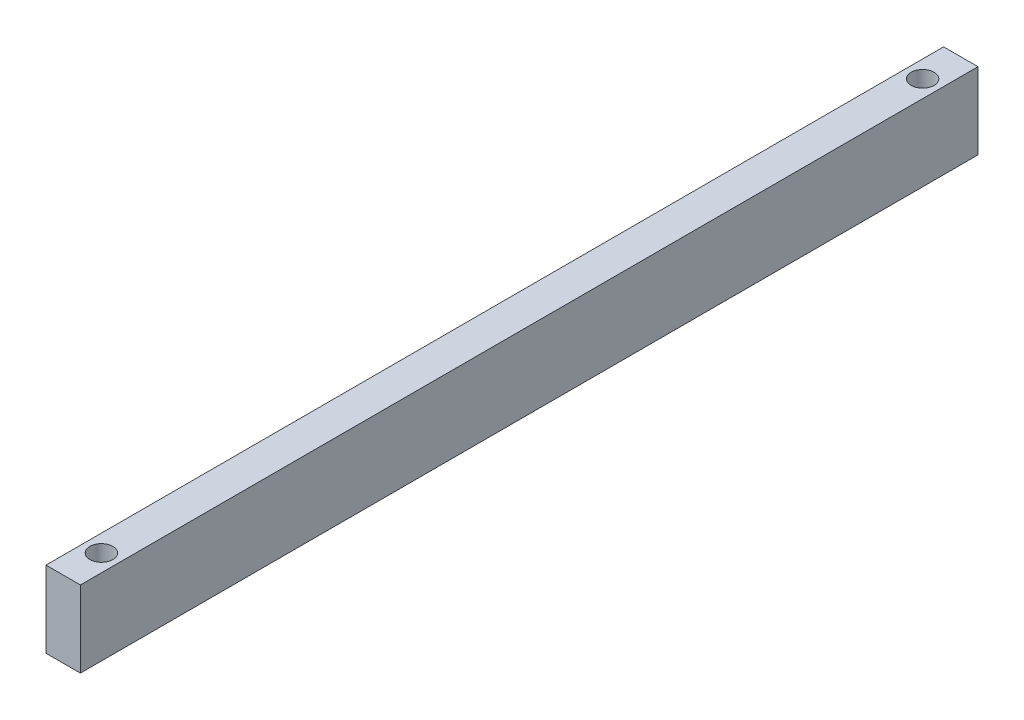
ISO-10303-21;
HEADER;
FILE_DESCRIPTION(('STEP AP214'),'2;1');
FILE_NAME('part.step','',(''),(''),'','','');
FILE_SCHEMA(('AUTOMOTIVE_DESIGN { 1 0 10303 214 1 1 1 1 }'));
ENDSEC;
DATA;
#1=APPLICATION_CONTEXT('core data for automotive mechanical design processes');
#2=APPLICATION_PROTOCOL_DEFINITION('international standard','automotive_design',2000,#1);
#3=PRODUCT_CONTEXT('',#1,'mechanical');
#4=PRODUCT('Part','Part','',(#3));
#5=PRODUCT_RELATED_PRODUCT_CATEGORY('part','',(#4));
#6=PRODUCT_DEFINITION_FORMATION('','',#4);
#7=PRODUCT_DEFINITION_CONTEXT('part definition',#1,'design');
#8=PRODUCT_DEFINITION('design','',#6,#7);
#9=PRODUCT_DEFINITION_SHAPE('','',#8);
#10=(LENGTH_UNIT() NAMED_UNIT(*) SI_UNIT(.MILLI.,.METRE.));
#11=(NAMED_UNIT(*) PLANE_ANGLE_UNIT() SI_UNIT($,.RADIAN.));
#12=(NAMED_UNIT(*) SI_UNIT($,.STERADIAN.) SOLID_ANGLE_UNIT());
#13=UNCERTAINTY_MEASURE_WITH_UNIT(LENGTH_MEASURE(1.E-05),#10,'distance_accuracy_value','');
#14=(GEOMETRIC_REPRESENTATION_CONTEXT(3) GLOBAL_UNCERTAINTY_ASSIGNED_CONTEXT((#13)) GLOBAL_UNIT_ASSIGNED_CONTEXT((#10,
#11,#12)) REPRESENTATION_CONTEXT('',''));
#15=CARTESIAN_POINT('',(0.,0.,0.));
#16=DIRECTION('',(0.,0.,1.));
#17=DIRECTION('',(1.,0.,0.));
#18=AXIS2_PLACEMENT_3D('',#15,#16,#17);
#19=CARTESIAN_POINT('',(4.5,-10.,117.5));
#20=DIRECTION('',(-1.,0.,0.));
#21=DIRECTION('',(0.,0.,1.));
#22=AXIS2_PLACEMENT_3D('',#19,#20,#21);
#23=PLANE('',#22);
#24=DIRECTION('',(0.,1.,0.));
#25=VECTOR('',#24,1.);
#26=CARTESIAN_POINT('',(4.5,-10.,-117.5));
#27=LINE('',#26,#25);
#28=CARTESIAN_POINT('',(4.5,-10.,-117.5));
#29=VERTEX_POINT('',#28);
#30=CARTESIAN_POINT('',(4.5,10.,-117.5));
#31=VERTEX_POINT('',#30);
#32=EDGE_CURVE('E103',#29,#31,#27,.T.);
#33=ORIENTED_EDGE('',*,*,#32,.T.);
#34=DIRECTION('',(0.,0.,-1.));
#35=VECTOR('',#34,1.);
#36=CARTESIAN_POINT('',(4.5,10.,117.5));
#37=LINE('',#36,#35);
#38=CARTESIAN_POINT('',(4.5,10.,117.5));
#39=VERTEX_POINT('',#38);
#40=EDGE_CURVE('E11',#39,#31,#37,.T.);
#41=ORIENTED_EDGE('',*,*,#40,.F.);
#42=DIRECTION('',(0.,1.,0.));
#43=VECTOR('',#42,1.);
#44=CARTESIAN_POINT('',(4.5,-10.,117.5));
#45=LINE('',#44,#43);
#46=CARTESIAN_POINT('',(4.5,-10.,117.5));
#47=VERTEX_POINT('',#46);
#48=EDGE_CURVE('E91',#47,#39,#45,.T.);
#49=ORIENTED_EDGE('',*,*,#48,.F.);
#50=DIRECTION('',(0.,0.,-1.));
#51=VECTOR('',#50,1.);
#52=CARTESIAN_POINT('',(4.5,-10.,117.5));
#53=LINE('',#52,#51);
#54=EDGE_CURVE('E99',#47,#29,#53,.T.);
#55=ORIENTED_EDGE('',*,*,#54,.T.);
#56=EDGE_LOOP('',(#33,#41,#49,#55));
#57=FACE_BOUND('',#56,.T.);
#58=ADVANCED_FACE('F40',(#57),#23,.F.);
#59=CARTESIAN_POINT('',(-4.5,10.,117.5));
#60=DIRECTION('',(0.,-1.,0.));
#61=DIRECTION('',(0.,0.,-1.));
#62=AXIS2_PLACEMENT_3D('',#59,#60,#61);
#63=PLANE('',#62);
#64=CARTESIAN_POINT('',(0.,10.,-107.5));
#65=DIRECTION('',(0.,-1.,0.));
#66=DIRECTION('',(0.,0.,-1.));
#67=AXIS2_PLACEMENT_3D('',#64,#65,#66);
#68=CIRCLE('',#67,3.);
#69=CARTESIAN_POINT('',(0.,10.,-110.5));
#70=VERTEX_POINT('',#69);
#71=EDGE_CURVE('E123',#70,#70,#68,.T.);
#72=ORIENTED_EDGE('',*,*,#71,.T.);
#73=EDGE_LOOP('',(#72));
#74=FACE_BOUND('',#73,.T.);
#75=CARTESIAN_POINT('',(0.,10.,107.5));
#76=DIRECTION('',(0.,1.,0.));
#77=DIRECTION('',(0.,0.,1.));
#78=AXIS2_PLACEMENT_3D('',#75,#76,#77);
#79=CIRCLE('',#78,3.);
#80=CARTESIAN_POINT('',(0.,10.,110.5));
#81=VERTEX_POINT('',#80);
#82=EDGE_CURVE('E117',#81,#81,#79,.T.);
#83=ORIENTED_EDGE('',*,*,#82,.F.);
#84=EDGE_LOOP('',(#83));
#85=FACE_BOUND('',#84,.T.);
#86=DIRECTION('',(-1.,0.,0.));
#87=VECTOR('',#86,1.);
#88=CARTESIAN_POINT('',(-4.5,10.,-117.5));
#89=LINE('',#88,#87);
#90=CARTESIAN_POINT('',(-4.5,10.,-117.5));
#91=VERTEX_POINT('',#90);
#92=EDGE_CURVE('E95',#31,#91,#89,.T.);
#93=ORIENTED_EDGE('',*,*,#92,.T.);
#94=DIRECTION('',(0.,0.,-1.));
#95=VECTOR('',#94,1.);
#96=CARTESIAN_POINT('',(-4.5,10.,117.5));
#97=LINE('',#96,#95);
#98=CARTESIAN_POINT('',(-4.5,10.,117.5));
#99=VERTEX_POINT('',#98);
#100=EDGE_CURVE('E48',#99,#91,#97,.T.);
#101=ORIENTED_EDGE('',*,*,#100,.F.);
#102=DIRECTION('',(-1.,0.,0.));
#103=VECTOR('',#102,1.);
#104=CARTESIAN_POINT('',(-4.5,10.,117.5));
#105=LINE('',#104,#103);
#106=EDGE_CURVE('E86',#39,#99,#105,.T.);
#107=ORIENTED_EDGE('',*,*,#106,.F.);
#108=ORIENTED_EDGE('',*,*,#40,.T.);
#109=EDGE_LOOP('',(#93,#101,#107,#108));
#110=FACE_BOUND('',#109,.T.);
#111=ADVANCED_FACE('F94',(#74,#85,#110),#63,.F.);
#112=CARTESIAN_POINT('',(-4.5,-10.,117.5));
#113=DIRECTION('',(1.,0.,0.));
#114=DIRECTION('',(0.,0.,-1.));
#115=AXIS2_PLACEMENT_3D('',#112,#113,#114);
#116=PLANE('',#115);
#117=DIRECTION('',(0.,-1.,0.));
#118=VECTOR('',#117,1.);
#119=CARTESIAN_POINT('',(-4.5,-10.,-117.5));
#120=LINE('',#119,#118);
#121=CARTESIAN_POINT('',(-4.5,-10.,-117.5));
#122=VERTEX_POINT('',#121);
#123=EDGE_CURVE('E73',#91,#122,#120,.T.);
#124=ORIENTED_EDGE('',*,*,#123,.T.);
#125=DIRECTION('',(0.,0.,-1.));
#126=VECTOR('',#125,1.);
#127=CARTESIAN_POINT('',(-4.5,-10.,117.5));
#128=LINE('',#127,#126);
#129=CARTESIAN_POINT('',(-4.5,-10.,117.5));
#130=VERTEX_POINT('',#129);
#131=EDGE_CURVE('E96',#130,#122,#128,.T.);
#132=ORIENTED_EDGE('',*,*,#131,.F.);
#133=DIRECTION('',(0.,-1.,0.));
#134=VECTOR('',#133,1.);
#135=CARTESIAN_POINT('',(-4.5,-10.,117.5));
#136=LINE('',#135,#134);
#137=EDGE_CURVE('E89',#99,#130,#136,.T.);
#138=ORIENTED_EDGE('',*,*,#137,.F.);
#139=ORIENTED_EDGE('',*,*,#100,.T.);
#140=EDGE_LOOP('',(#124,#132,#138,#139));
#141=FACE_BOUND('',#140,.T.);
#142=ADVANCED_FACE('F97',(#141),#116,.F.);
#143=CARTESIAN_POINT('',(-4.5,-10.,117.5));
#144=DIRECTION('',(0.,1.,0.));
#145=DIRECTION('',(0.,0.,1.));
#146=AXIS2_PLACEMENT_3D('',#143,#144,#145);
#147=PLANE('',#146);
#148=CARTESIAN_POINT('',(0.,-10.,-107.5));
#149=DIRECTION('',(0.,-1.,0.));
#150=DIRECTION('',(0.,0.,-1.));
#151=AXIS2_PLACEMENT_3D('',#148,#149,#150);
#152=CIRCLE('',#151,3.);
#153=CARTESIAN_POINT('',(0.,-10.,-110.5));
#154=VERTEX_POINT('',#153);
#155=EDGE_CURVE('E120',#154,#154,#152,.T.);
#156=ORIENTED_EDGE('',*,*,#155,.F.);
#157=EDGE_LOOP('',(#156));
#158=FACE_BOUND('',#157,.T.);
#159=CARTESIAN_POINT('',(0.,-10.,107.5));
#160=DIRECTION('',(0.,1.,0.));
#161=DIRECTION('',(0.,0.,1.));
#162=AXIS2_PLACEMENT_3D('',#159,#160,#161);
#163=CIRCLE('',#162,3.);
#164=CARTESIAN_POINT('',(0.,-10.,110.5));
#165=VERTEX_POINT('',#164);
#166=EDGE_CURVE('E106',#165,#165,#163,.T.);
#167=ORIENTED_EDGE('',*,*,#166,.T.);
#168=EDGE_LOOP('',(#167));
#169=FACE_BOUND('',#168,.T.);
#170=DIRECTION('',(1.,0.,0.));
#171=VECTOR('',#170,1.);
#172=CARTESIAN_POINT('',(-4.5,-10.,-117.5));
#173=LINE('',#172,#171);
#174=EDGE_CURVE('E79',#122,#29,#173,.T.);
#175=ORIENTED_EDGE('',*,*,#174,.T.);
#176=ORIENTED_EDGE('',*,*,#54,.F.);
#177=DIRECTION('',(1.,0.,0.));
#178=VECTOR('',#177,1.);
#179=CARTESIAN_POINT('',(-4.5,-10.,117.5));
#180=LINE('',#179,#178);
#181=EDGE_CURVE('E56',#130,#47,#180,.T.);
#182=ORIENTED_EDGE('',*,*,#181,.F.);
#183=ORIENTED_EDGE('',*,*,#131,.T.);
#184=EDGE_LOOP('',(#175,#176,#182,#183));
#185=FACE_BOUND('',#184,.T.);
#186=ADVANCED_FACE('F111',(#158,#169,#185),#147,.F.);
#187=CARTESIAN_POINT('',(0.,0.,117.5));
#188=DIRECTION('',(0.,0.,-1.));
#189=DIRECTION('',(-1.,0.,0.));
#190=AXIS2_PLACEMENT_3D('',#187,#188,#189);
#191=PLANE('',#190);
#192=ORIENTED_EDGE('',*,*,#48,.T.);
#193=ORIENTED_EDGE('',*,*,#106,.T.);
#194=ORIENTED_EDGE('',*,*,#137,.T.);
#195=ORIENTED_EDGE('',*,*,#181,.T.);
#196=EDGE_LOOP('',(#192,#193,#194,#195));
#197=FACE_BOUND('',#196,.T.);
#198=ADVANCED_FACE('F87',(#197),#191,.F.);
#199=CARTESIAN_POINT('',(0.,0.,-117.5));
#200=DIRECTION('',(0.,0.,-1.));
#201=DIRECTION('',(-1.,0.,0.));
#202=AXIS2_PLACEMENT_3D('',#199,#200,#201);
#203=PLANE('',#202);
#204=ORIENTED_EDGE('',*,*,#32,.F.);
#205=ORIENTED_EDGE('',*,*,#174,.F.);
#206=ORIENTED_EDGE('',*,*,#123,.F.);
#207=ORIENTED_EDGE('',*,*,#92,.F.);
#208=EDGE_LOOP('',(#204,#205,#206,#207));
#209=FACE_BOUND('',#208,.T.);
#210=ADVANCED_FACE('F114',(#209),#203,.T.);
#211=CARTESIAN_POINT('',(0.,-10.,107.5));
#212=DIRECTION('',(0.,1.,0.));
#213=DIRECTION('',(0.,0.,1.));
#214=AXIS2_PLACEMENT_3D('',#211,#212,#213);
#215=CYLINDRICAL_SURFACE('',#214,3.);
#216=ORIENTED_EDGE('',*,*,#166,.F.);
#217=EDGE_LOOP('',(#216));
#218=FACE_BOUND('',#217,.T.);
#219=ORIENTED_EDGE('',*,*,#82,.T.);
#220=EDGE_LOOP('',(#219));
#221=FACE_BOUND('',#220,.T.);
#222=ADVANCED_FACE('F137',(#218,#221),#215,.F.);
#223=CARTESIAN_POINT('',(0.,-10.,-107.5));
#224=DIRECTION('',(0.,1.,0.));
#225=DIRECTION('',(0.,0.,1.));
#226=AXIS2_PLACEMENT_3D('',#223,#224,#225);
#227=CYLINDRICAL_SURFACE('',#226,3.);
#228=ORIENTED_EDGE('',*,*,#155,.T.);
#229=EDGE_LOOP('',(#228));
#230=FACE_BOUND('',#229,.T.);
#231=ORIENTED_EDGE('',*,*,#71,.F.);
#232=EDGE_LOOP('',(#231));
#233=FACE_BOUND('',#232,.T.);
#234=ADVANCED_FACE('F129',(#230,#233),#227,.F.);
#235=CLOSED_SHELL('',(#58,#111,#142,#186,#198,#210,#222,#234));
#236=MANIFOLD_SOLID_BREP('B2',#235);
#237=ADVANCED_BREP_SHAPE_REPRESENTATION('',(#18,#236),#14);
#238=SHAPE_DEFINITION_REPRESENTATION(#9,#237);
ENDSEC;
END-ISO-10303-21;
